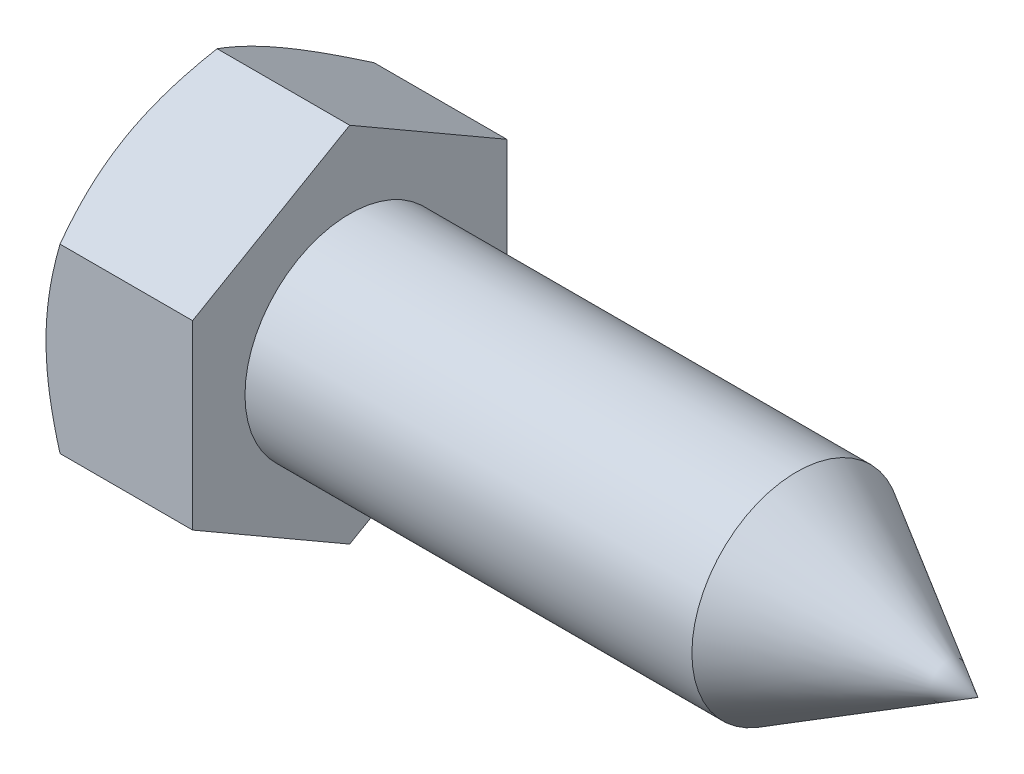
ISO-10303-21;
HEADER;
FILE_DESCRIPTION(('STEP AP214'),'2;1');
FILE_NAME('part.step','',(''),(''),'','','');
FILE_SCHEMA(('AUTOMOTIVE_DESIGN { 1 0 10303 214 1 1 1 1 }'));
ENDSEC;
DATA;
#1=APPLICATION_CONTEXT('core data for automotive mechanical design processes');
#2=APPLICATION_PROTOCOL_DEFINITION('international standard','automotive_design',2000,#1);
#3=PRODUCT_CONTEXT('',#1,'mechanical');
#4=PRODUCT('Part','Part','',(#3));
#5=PRODUCT_RELATED_PRODUCT_CATEGORY('part','',(#4));
#6=PRODUCT_DEFINITION_FORMATION('','',#4);
#7=PRODUCT_DEFINITION_CONTEXT('part definition',#1,'design');
#8=PRODUCT_DEFINITION('design','',#6,#7);
#9=PRODUCT_DEFINITION_SHAPE('','',#8);
#10=(LENGTH_UNIT() NAMED_UNIT(*) SI_UNIT(.MILLI.,.METRE.));
#11=(NAMED_UNIT(*) PLANE_ANGLE_UNIT() SI_UNIT($,.RADIAN.));
#12=(NAMED_UNIT(*) SI_UNIT($,.STERADIAN.) SOLID_ANGLE_UNIT());
#13=UNCERTAINTY_MEASURE_WITH_UNIT(LENGTH_MEASURE(1.E-05),#10,'distance_accuracy_value','');
#14=(GEOMETRIC_REPRESENTATION_CONTEXT(3) GLOBAL_UNCERTAINTY_ASSIGNED_CONTEXT((#13)) GLOBAL_UNIT_ASSIGNED_CONTEXT((#10,
#11,#12)) REPRESENTATION_CONTEXT('',''));
#15=CARTESIAN_POINT('',(0.,0.,0.));
#16=DIRECTION('',(0.,0.,1.));
#17=DIRECTION('',(1.,0.,0.));
#18=AXIS2_PLACEMENT_3D('',#15,#16,#17);
#19=CARTESIAN_POINT('',(17.78,10.9985226280624,-19.05));
#20=DIRECTION('',(0.,-0.866025403784438,0.500000000000001));
#21=DIRECTION('',(0.,-0.500000000000001,-0.866025403784438));
#22=AXIS2_PLACEMENT_3D('',#19,#20,#21);
#23=PLANE('',#22);
#24=CARTESIAN_POINT('',(1.70154403912923,21.9971607261786,0.0002));
#25=CARTESIAN_POINT('',(1.56198341710824,21.7554177843714,-0.418511057581224));
#26=CARTESIAN_POINT('',(1.42875584552933,21.5127319153775,-0.83885531295774));
#27=CARTESIAN_POINT('',(1.17672716507822,21.0254141255284,-1.68291448440842));
#28=CARTESIAN_POINT('',(1.05793080103128,20.7807815926483,-2.10663046054107));
#29=CARTESIAN_POINT('',(0.83636140347077,20.2890976796135,-2.95825197918165));
#30=CARTESIAN_POINT('',(0.733626282713295,20.0420419967675,-3.38616497416956));
#31=CARTESIAN_POINT('',(0.546385434087819,19.5462139577042,-4.24496432964444));
#32=CARTESIAN_POINT('',(0.461878662220422,19.2974417006436,-4.67585051838702));
#33=CARTESIAN_POINT('',(0.314688827717645,18.8045548928814,-5.5295555118115));
#34=CARTESIAN_POINT('',(0.251518592005309,18.5604769338332,-5.95231093789062));
#35=CARTESIAN_POINT('',(0.145596345015138,18.0712026189753,-6.79975891006299));
#36=CARTESIAN_POINT('',(0.102844726760496,17.8260062417296,-7.22445149328434));
#37=CARTESIAN_POINT('',(0.0388391678998689,17.3352016053642,-8.07455006005963));
#38=CARTESIAN_POINT('',(0.0175596817216244,17.0895941847176,-8.49995459133542));
#39=CARTESIAN_POINT('',(-0.00304398488096682,16.5981526433441,-9.3511563099444));
#40=CARTESIAN_POINT('',(-0.00236884372942559,16.3523185298569,-9.77695348473787));
#41=CARTESIAN_POINT('',(0.0194033988503021,15.8927264269825,-10.5729903576738));
#42=CARTESIAN_POINT('',(0.03784556993526,15.6789356908011,-10.9432867749275));
#43=CARTESIAN_POINT('',(0.0909844304102486,15.2518641922012,-11.6829963089671));
#44=CARTESIAN_POINT('',(0.125680887003942,15.0385834225228,-12.0524094383274));
#45=CARTESIAN_POINT('',(0.210726274890309,14.612612663106,-12.7902124361761));
#46=CARTESIAN_POINT('',(0.261089360566662,14.3999233837905,-13.1586010741756));
#47=CARTESIAN_POINT('',(0.376579300829333,13.9755573155246,-13.8936246654204));
#48=CARTESIAN_POINT('',(0.441706092858117,13.7638805222879,-14.2602596260897));
#49=CARTESIAN_POINT('',(0.660888399543239,13.121308345357,-15.3732272840641));
#50=CARTESIAN_POINT('',(0.83679916932043,12.6922737800414,-16.116336949394));
#51=CARTESIAN_POINT('',(1.23604434094317,11.840601970659,-17.5914757946184));
#52=CARTESIAN_POINT('',(1.4592849825153,11.4179538228748,-18.3235238603055));
#53=CARTESIAN_POINT('',(1.70154403912921,10.9984071580085,-19.0502));
#54=B_SPLINE_CURVE_WITH_KNOTS('',3,(#24,#25,#26,#27,#28,#29,#30,#31,#32,#33,#34,#35,#36,#37,#38,
#39,#40,#41,#42,#43,#44,#45,#46,#47,#48,#49,#50,#51,#52,#53),.UNSPECIFIED.,.F.,.F.,(4,2,2,2,2,2,
2,2,2,2,2,2,2,2,4),(0.,1.50971559281794,3.01992622800796,4.53364959201314,6.04728623691164,
7.52356313869613,8.99986845512143,10.4744153207586,11.9489166211861,13.2325441548787,
14.5161533048254,15.8009255464228,17.085692344219,19.7118183650731,22.3327898553892),.UNSPECIFIED.);
#55=CARTESIAN_POINT('',(1.70147737193763,21.9970452561248,0.));
#56=VERTEX_POINT('',#55);
#57=CARTESIAN_POINT('',(0.,16.4977839420935,-9.52500000000003));
#58=VERTEX_POINT('',#57);
#59=EDGE_CURVE('E48',#56,#58,#54,.T.);
#60=ORIENTED_EDGE('',*,*,#59,.F.);
#61=DIRECTION('',(-1.,0.,0.));
#62=VECTOR('',#61,1.);
#63=CARTESIAN_POINT('',(17.78,21.9970452561248,0.));
#64=LINE('',#63,#62);
#65=CARTESIAN_POINT('',(17.78,21.9970452561248,0.));
#66=VERTEX_POINT('',#65);
#67=EDGE_CURVE('E147',#66,#56,#64,.T.);
#68=ORIENTED_EDGE('',*,*,#67,.F.);
#69=DIRECTION('',(0.,0.500000000000001,0.866025403784438));
#70=VECTOR('',#69,1.);
#71=CARTESIAN_POINT('',(17.78,10.9985226280624,-19.05));
#72=LINE('',#71,#70);
#73=CARTESIAN_POINT('',(17.78,10.9985226280624,-19.05));
#74=VERTEX_POINT('',#73);
#75=EDGE_CURVE('E232',#74,#66,#72,.T.);
#76=ORIENTED_EDGE('',*,*,#75,.F.);
#77=DIRECTION('',(-1.,0.,0.));
#78=VECTOR('',#77,1.);
#79=CARTESIAN_POINT('',(17.78,10.9985226280624,-19.05));
#80=LINE('',#79,#78);
#81=CARTESIAN_POINT('',(1.70147737193761,10.9985226280624,-19.05));
#82=VERTEX_POINT('',#81);
#83=EDGE_CURVE('E135',#74,#82,#80,.T.);
#84=ORIENTED_EDGE('',*,*,#83,.T.);
#85=EDGE_CURVE('E129',#58,#82,#54,.T.);
#86=ORIENTED_EDGE('',*,*,#85,.F.);
#87=EDGE_LOOP('',(#60,#68,#76,#84,#86));
#88=FACE_BOUND('',#87,.T.);
#89=ADVANCED_FACE('F32',(#88),#23,.F.);
#90=CARTESIAN_POINT('',(17.78,21.9970452561248,0.));
#91=DIRECTION('',(0.,-0.866025403784438,-0.500000000000001));
#92=DIRECTION('',(0.,0.500000000000001,-0.866025403784438));
#93=AXIS2_PLACEMENT_3D('',#90,#91,#92);
#94=PLANE('',#93);
#95=CARTESIAN_POINT('',(1.70154403912922,10.9984071580085,19.0502));
#96=CARTESIAN_POINT('',(1.56198341710822,11.2401500998157,18.6314889424188));
#97=CARTESIAN_POINT('',(1.42875584552932,11.4828359688097,18.2111446870423));
#98=CARTESIAN_POINT('',(1.17672716507821,11.9701537586587,17.3670855155916));
#99=CARTESIAN_POINT('',(1.05793080103127,12.2147862915388,16.9433695394589));
#100=CARTESIAN_POINT('',(0.836361403470762,12.7064702045736,16.0917480208183));
#101=CARTESIAN_POINT('',(0.733626282713287,12.9535258874196,15.6638350258304));
#102=CARTESIAN_POINT('',(0.546385434087812,13.4493539264829,14.8050356703556));
#103=CARTESIAN_POINT('',(0.461878662220417,13.6981261835436,14.374149481613));
#104=CARTESIAN_POINT('',(0.314688827717642,14.1910129913057,13.5204444881885));
#105=CARTESIAN_POINT('',(0.251518592005306,14.4350909503539,13.0976890621094));
#106=CARTESIAN_POINT('',(0.145596345015136,14.9243652652118,12.250241089937));
#107=CARTESIAN_POINT('',(0.102844726760495,15.1695616424575,11.8255485067157));
#108=CARTESIAN_POINT('',(0.0388391678998689,15.6603662788229,10.9754499399404));
#109=CARTESIAN_POINT('',(0.0175596817216246,15.9059736994695,10.5500454086646));
#110=CARTESIAN_POINT('',(-0.00304398488096499,16.397415240843,9.69884369005561));
#111=CARTESIAN_POINT('',(-0.00236884372942224,16.6432493543302,9.27304651526214));
#112=CARTESIAN_POINT('',(0.0194033988503066,17.1028414572046,8.47700964232625));
#113=CARTESIAN_POINT('',(0.0378455699352645,17.316632193386,8.10671322507253));
#114=CARTESIAN_POINT('',(0.0909844304102546,17.7437036919859,7.36700369103291));
#115=CARTESIAN_POINT('',(0.125680887003949,17.9569844616643,6.99759056167259));
#116=CARTESIAN_POINT('',(0.210726274890318,18.3829552210812,6.25978756382388));
#117=CARTESIAN_POINT('',(0.26108936056667,18.5956445003966,5.89139892582437));
#118=CARTESIAN_POINT('',(0.376579300829342,19.0200105686625,5.15637533457961));
#119=CARTESIAN_POINT('',(0.441706092858128,19.2316873618992,4.7897403739103));
#120=CARTESIAN_POINT('',(0.660888399543252,19.8742595388301,3.67677271593589));
#121=CARTESIAN_POINT('',(0.836799169320443,20.3032941041457,2.93366305060603));
#122=CARTESIAN_POINT('',(1.23604434094318,21.1549659135281,1.45852420538159));
#123=CARTESIAN_POINT('',(1.45928498251531,21.5776140613123,0.726476139694543));
#124=CARTESIAN_POINT('',(1.70154403912923,21.9971607261786,-0.000199999999998885));
#125=B_SPLINE_CURVE_WITH_KNOTS('',3,(#95,#96,#97,#98,#99,#100,#101,#102,#103,#104,#105,#106,
#107,#108,#109,#110,#111,#112,#113,#114,#115,#116,#117,#118,#119,#120,#121,#122,#123,#124),
.UNSPECIFIED.,.F.,.F.,(4,2,2,2,2,2,2,2,2,2,2,2,2,2,4),(0.,1.50971559281794,3.01992622800796,
4.53364959201314,6.04728623691163,7.52356313869613,8.99986845512142,10.4744153207586,
11.9489166211861,13.2325441548787,14.5161533048254,15.8009255464228,17.085692344219,
19.7118183650731,22.3327898553892),.UNSPECIFIED.);
#126=CARTESIAN_POINT('',(1.70147737193762,10.9985226280624,19.05));
#127=VERTEX_POINT('',#126);
#128=CARTESIAN_POINT('',(0.,16.4977839420935,9.52500000000002));
#129=VERTEX_POINT('',#128);
#130=EDGE_CURVE('E55',#127,#129,#125,.T.);
#131=ORIENTED_EDGE('',*,*,#130,.F.);
#132=DIRECTION('',(-1.,0.,0.));
#133=VECTOR('',#132,1.);
#134=CARTESIAN_POINT('',(17.78,10.9985226280624,19.05));
#135=LINE('',#134,#133);
#136=CARTESIAN_POINT('',(17.78,10.9985226280624,19.05));
#137=VERTEX_POINT('',#136);
#138=EDGE_CURVE('E145',#137,#127,#135,.T.);
#139=ORIENTED_EDGE('',*,*,#138,.F.);
#140=DIRECTION('',(0.,-0.500000000000001,0.866025403784438));
#141=VECTOR('',#140,1.);
#142=CARTESIAN_POINT('',(17.78,21.9970452561248,0.));
#143=LINE('',#142,#141);
#144=EDGE_CURVE('E230',#66,#137,#143,.T.);
#145=ORIENTED_EDGE('',*,*,#144,.F.);
#146=ORIENTED_EDGE('',*,*,#67,.T.);
#147=EDGE_CURVE('E162',#129,#56,#125,.T.);
#148=ORIENTED_EDGE('',*,*,#147,.F.);
#149=EDGE_LOOP('',(#131,#139,#145,#146,#148));
#150=FACE_BOUND('',#149,.T.);
#151=ADVANCED_FACE('F168',(#150),#94,.F.);
#152=CARTESIAN_POINT('',(17.78,10.9985226280624,19.05));
#153=DIRECTION('',(0.,0.,-1.));
#154=DIRECTION('',(-1.,0.,0.));
#155=AXIS2_PLACEMENT_3D('',#152,#153,#154);
#156=PLANE('',#155);
#157=CARTESIAN_POINT('',(9.36387045247343,-29.681284606613,19.05));
#158=CARTESIAN_POINT('',(9.16146582961974,-29.264706606806,19.05));
#159=CARTESIAN_POINT('',(8.96006010911688,-28.8476434945091,19.05));
#160=CARTESIAN_POINT('',(8.55947242837995,-28.0124458613825,19.05));
#161=CARTESIAN_POINT('',(8.36029049009429,-27.5943113300281,19.05));
#162=CARTESIAN_POINT('',(7.7663676810725,-26.3380393948462,19.05));
#163=CARTESIAN_POINT('',(7.37530881268534,-25.498154743662,19.05));
#164=CARTESIAN_POINT('',(6.60327220097087,-23.808305939745,19.05));
#165=CARTESIAN_POINT('',(6.22235974347411,-22.9583118892264,19.05));
#166=CARTESIAN_POINT('',(5.47593301915302,-21.2516124787001,19.05));
#167=CARTESIAN_POINT('',(5.11041803414068,-20.3949074339305,19.05));
#168=CARTESIAN_POINT('',(4.38719116879672,-18.6452025304738,19.05));
#169=CARTESIAN_POINT('',(4.03012757182363,-17.7519333199389,19.05));
#170=CARTESIAN_POINT('',(3.34269044233918,-15.9549889007312,19.05));
#171=CARTESIAN_POINT('',(3.01231988615571,-15.0513125444405,19.05));
#172=CARTESIAN_POINT('',(2.38684616332965,-13.2337927829517,19.05));
#173=CARTESIAN_POINT('',(2.09167277054079,-12.3199737386897,19.05));
#174=CARTESIAN_POINT('',(1.54595671315604,-10.4791413209231,19.05));
#175=CARTESIAN_POINT('',(1.29540013570895,-9.55213215820611,19.05));
#176=CARTESIAN_POINT('',(0.962715893913424,-8.15413474991851,19.05));
#177=CARTESIAN_POINT('',(0.859241701469715,-7.68819648348643,19.05));
#178=CARTESIAN_POINT('',(0.667894608167373,-6.75311076402833,19.05));
#179=CARTESIAN_POINT('',(0.580021393447899,-6.28396337576073,19.05));
#180=CARTESIAN_POINT('',(0.421420281134063,-5.34278179688777,19.05));
#181=CARTESIAN_POINT('',(0.350691777614133,-4.87074770890834,19.05));
#182=CARTESIAN_POINT('',(0.227781142117217,-3.92425443579507,19.05));
#183=CARTESIAN_POINT('',(0.175598996477116,-3.44979525244806,19.05));
#184=CARTESIAN_POINT('',(0.091484358665081,-2.50539642167933,19.05));
#185=CARTESIAN_POINT('',(0.0592932834122934,-2.03547994750786,19.05));
#186=CARTESIAN_POINT('',(0.0148196511049127,-1.09470720819043,19.05));
#187=CARTESIAN_POINT('',(0.00253675993371639,-0.623850958949376,19.05));
#188=CARTESIAN_POINT('',(-0.00182781610310269,0.317959597669875,19.05));
#189=CARTESIAN_POINT('',(0.00609054987868912,0.788913905291908,19.05));
#190=CARTESIAN_POINT('',(0.0419336308306925,1.73006593492375,19.05));
#191=CARTESIAN_POINT('',(0.0698592408268269,2.20026362214292,19.05));
#192=CARTESIAN_POINT('',(0.160085140812835,3.32615149168687,19.05));
#193=CARTESIAN_POINT('',(0.231647760253748,3.9811127561872,19.05));
#194=CARTESIAN_POINT('',(0.409728300065855,5.2862687094639,19.05));
#195=CARTESIAN_POINT('',(0.516250858977386,5.93646275400804,19.05));
#196=CARTESIAN_POINT('',(0.760462128297077,7.23143263105088,19.05));
#197=CARTESIAN_POINT('',(0.898174747996119,7.87620391130365,19.05));
#198=CARTESIAN_POINT('',(1.20055584405695,9.159324879215,19.05));
#199=CARTESIAN_POINT('',(1.36522394390489,9.79767465643689,19.05));
#200=CARTESIAN_POINT('',(1.7214113056863,11.0820581020298,19.05));
#201=CARTESIAN_POINT('',(1.91344522350516,11.7279480495079,19.05));
#202=CARTESIAN_POINT('',(2.31762854711575,13.0133672560354,19.05));
#203=CARTESIAN_POINT('',(2.52977808690826,13.6528964726813,19.05));
#204=CARTESIAN_POINT('',(2.97080026317714,14.9259053212631,19.05));
#205=CARTESIAN_POINT('',(3.19966751894679,15.5593868261181,19.05));
#206=CARTESIAN_POINT('',(3.67140574966712,16.8210826190597,19.05));
#207=CARTESIAN_POINT('',(3.91427655235636,17.4492969718302,19.05));
#208=CARTESIAN_POINT('',(4.50783243685458,18.9429543286684,19.05));
#209=CARTESIAN_POINT('',(4.86391009787127,19.8062512923856,19.05));
#210=CARTESIAN_POINT('',(5.59369975040599,21.5253820385326,19.05));
#211=CARTESIAN_POINT('',(5.96741288850359,22.3812153314103,19.05));
#212=CARTESIAN_POINT('',(6.72890710622893,24.0868250540015,19.05));
#213=CARTESIAN_POINT('',(7.11669148004349,24.9366000089695,19.05));
#214=CARTESIAN_POINT('',(7.90345923334426,26.63091294583,19.05));
#215=CARTESIAN_POINT('',(8.3024423596857,27.4754510455742,19.05));
#216=CARTESIAN_POINT('',(9.10995217038491,29.161125765359,19.05));
#217=CARTESIAN_POINT('',(9.5184891939498,30.0022574236751,19.05));
#218=CARTESIAN_POINT('',(10.3430229269526,31.6808559628692,19.05));
#219=CARTESIAN_POINT('',(10.7590196703666,32.518322827034,19.05));
#220=CARTESIAN_POINT('',(11.5971269180795,34.1900490644371,19.05));
#221=CARTESIAN_POINT('',(12.0192366018988,35.0243088494536,19.05));
#222=CARTESIAN_POINT('',(12.8686125952728,36.6901944514231,19.05));
#223=CARTESIAN_POINT('',(13.2958788947363,37.5218202735267,19.05));
#224=CARTESIAN_POINT('',(14.510917657863,39.8716762337095,19.05));
#225=CARTESIAN_POINT('',(15.3037675196573,41.3872809173331,19.05));
#226=CARTESIAN_POINT('',(16.9002701357266,44.4128482567193,19.05));
#227=CARTESIAN_POINT('',(17.7039232916796,45.9228107000148,19.05));
#228=CARTESIAN_POINT('',(19.3174048995091,48.9344252680923,19.05));
#229=CARTESIAN_POINT('',(20.1272121106646,50.4360887804975,19.05));
#230=CARTESIAN_POINT('',(21.3467150335648,52.6859282817833,19.05));
#231=CARTESIAN_POINT('',(21.7540032158491,53.4354111964365,19.05));
#232=CARTESIAN_POINT('',(22.5700166567681,54.9335928565355,19.05));
#233=CARTESIAN_POINT('',(22.9787419131725,55.6822916031958,19.05));
#234=CARTESIAN_POINT('',(23.3881024870587,56.4306429205237,19.05));
#235=B_SPLINE_CURVE_WITH_KNOTS('',3,(#157,#158,#159,#160,#161,#162,#163,#164,#165,#166,#167,
#168,#169,#170,#171,#172,#173,#174,#175,#176,#177,#178,#179,#180,#181,#182,#183,#184,#185,#186,
#187,#188,#189,#190,#191,#192,#193,#194,#195,#196,#197,#198,#199,#200,#201,#202,#203,#204,#205,
#206,#207,#208,#209,#210,#211,#212,#213,#214,#215,#216,#217,#218,#219,#220,#221,#222,#223,#224,
#225,#226,#227,#228,#229,#230,#231,#232,#233,#234),.UNSPECIFIED.,.F.,.F.,(4,2,2,2,2,2,2,2,2,2,2,
2,2,2,2,2,2,2,2,2,2,2,2,2,2,2,2,2,2,2,2,2,2,2,2,2,2,2,4),(0.,1.38943761217531,2.77888892580274,
5.55819563283588,8.35240254614278,11.1464789839499,14.0321224955357,16.9180873194337,
19.7981940796754,22.6774011581476,24.1090510836395,25.5406722038995,26.9722427206616,
28.4038121827825,29.8164561105849,31.2290763299128,32.6417001048686,34.0543870776267,
36.0298747033623,38.0056245459738,39.9828940915955,41.9601360210948,43.9812438973033,
46.0023652381249,48.0228389099964,50.0432877327721,52.8445655115302,55.6460256683976,
58.4481459548751,61.2502029511148,64.0554471757798,66.8607041804397,69.665588089998,
72.4704665113671,77.6017760453958,82.7332768976462,87.8515588562165,90.4105564703669,
92.9695501149091),.UNSPECIFIED.);
#236=CARTESIAN_POINT('',(1.70147737193761,-10.9985226280623,19.05));
#237=VERTEX_POINT('',#236);
#238=CARTESIAN_POINT('',(0.,0.,19.05));
#239=VERTEX_POINT('',#238);
#240=EDGE_CURVE('E239',#237,#239,#235,.T.);
#241=ORIENTED_EDGE('',*,*,#240,.F.);
#242=DIRECTION('',(-1.,0.,0.));
#243=VECTOR('',#242,1.);
#244=CARTESIAN_POINT('',(17.78,-10.9985226280623,19.05));
#245=LINE('',#244,#243);
#246=CARTESIAN_POINT('',(17.78,-10.9985226280623,19.05));
#247=VERTEX_POINT('',#246);
#248=EDGE_CURVE('E137',#247,#237,#245,.T.);
#249=ORIENTED_EDGE('',*,*,#248,.F.);
#250=DIRECTION('',(0.,-1.,0.));
#251=VECTOR('',#250,1.);
#252=CARTESIAN_POINT('',(17.78,10.9985226280624,19.05));
#253=LINE('',#252,#251);
#254=EDGE_CURVE('E226',#137,#247,#253,.T.);
#255=ORIENTED_EDGE('',*,*,#254,.F.);
#256=ORIENTED_EDGE('',*,*,#138,.T.);
#257=EDGE_CURVE('E184',#239,#127,#235,.T.);
#258=ORIENTED_EDGE('',*,*,#257,.F.);
#259=EDGE_LOOP('',(#241,#249,#255,#256,#258));
#260=FACE_BOUND('',#259,.T.);
#261=ADVANCED_FACE('F245',(#260),#156,.F.);
#262=CARTESIAN_POINT('',(17.78,-21.9970452561248,0.));
#263=DIRECTION('',(0.,0.866025403784438,-0.500000000000002));
#264=DIRECTION('',(0.,0.500000000000002,0.866025403784438));
#265=AXIS2_PLACEMENT_3D('',#262,#263,#264);
#266=PLANE('',#265);
#267=CARTESIAN_POINT('',(1.70154403912923,-21.9971607261786,-0.000200000000000067));
#268=CARTESIAN_POINT('',(1.56198341710824,-21.7554177843714,0.418511057581222));
#269=CARTESIAN_POINT('',(1.42875584552933,-21.5127319153775,0.838855312957738));
#270=CARTESIAN_POINT('',(1.17672716507822,-21.0254141255284,1.68291448440842));
#271=CARTESIAN_POINT('',(1.05793080103128,-20.7807815926483,2.10663046054107));
#272=CARTESIAN_POINT('',(0.836361403470769,-20.2890976796135,2.95825197918165));
#273=CARTESIAN_POINT('',(0.733626282713293,-20.0420419967675,3.38616497416956));
#274=CARTESIAN_POINT('',(0.546385434087817,-19.5462139577042,4.24496432964444));
#275=CARTESIAN_POINT('',(0.461878662220421,-19.2974417006435,4.67585051838702));
#276=CARTESIAN_POINT('',(0.314688827717642,-18.8045548928814,5.5295555118115));
#277=CARTESIAN_POINT('',(0.251518592005304,-18.5604769338332,5.95231093789062));
#278=CARTESIAN_POINT('',(0.145596345015132,-18.0712026189753,6.79975891006298));
#279=CARTESIAN_POINT('',(0.102844726760491,-17.8260062417296,7.22445149328434));
#280=CARTESIAN_POINT('',(0.0388391678998642,-17.3352016053642,8.07455006005963));
#281=CARTESIAN_POINT('',(0.0175596817216182,-17.0895941847176,8.49995459133541));
#282=CARTESIAN_POINT('',(-0.00304398488097359,-16.5981526433441,9.35115630994439));
#283=CARTESIAN_POINT('',(-0.00236884372943127,-16.3523185298569,9.77695348473786));
#284=CARTESIAN_POINT('',(0.0194033988502967,-15.8927264269825,10.5729903576737));
#285=CARTESIAN_POINT('',(0.0378455699352542,-15.6789356908011,10.9432867749275));
#286=CARTESIAN_POINT('',(0.0909844304102423,-15.2518641922012,11.6829963089671));
#287=CARTESIAN_POINT('',(0.125680887003936,-15.0385834225228,12.0524094383274));
#288=CARTESIAN_POINT('',(0.210726274890302,-14.6126126631059,12.7902124361761));
#289=CARTESIAN_POINT('',(0.261089360566655,-14.3999233837905,13.1586010741756));
#290=CARTESIAN_POINT('',(0.376579300829327,-13.9755573155246,13.8936246654204));
#291=CARTESIAN_POINT('',(0.441706092858111,-13.7638805222879,14.2602596260897));
#292=CARTESIAN_POINT('',(0.660888399543233,-13.121308345357,15.3732272840641));
#293=CARTESIAN_POINT('',(0.836799169320424,-12.6922737800414,16.116336949394));
#294=CARTESIAN_POINT('',(1.23604434094316,-11.840601970659,17.5914757946184));
#295=CARTESIAN_POINT('',(1.45928498251529,-11.4179538228748,18.3235238603055));
#296=CARTESIAN_POINT('',(1.70154403912921,-10.9984071580085,19.0502));
#297=B_SPLINE_CURVE_WITH_KNOTS('',3,(#267,#268,#269,#270,#271,#272,#273,#274,#275,#276,#277,
#278,#279,#280,#281,#282,#283,#284,#285,#286,#287,#288,#289,#290,#291,#292,#293,#294,#295,#296),
.UNSPECIFIED.,.F.,.F.,(4,2,2,2,2,2,2,2,2,2,2,2,2,2,4),(0.,1.50971559281794,3.01992622800796,
4.53364959201314,6.04728623691164,7.52356313869613,8.99986845512143,10.4744153207586,
11.9489166211861,13.2325441548787,14.5161533048254,15.8009255464228,17.085692344219,
19.7118183650732,22.3327898553893),.UNSPECIFIED.);
#298=CARTESIAN_POINT('',(1.70147737193763,-21.9970452561248,0.));
#299=VERTEX_POINT('',#298);
#300=CARTESIAN_POINT('',(0.,-16.4977839420935,9.52500000000004));
#301=VERTEX_POINT('',#300);
#302=EDGE_CURVE('E170',#299,#301,#297,.T.);
#303=ORIENTED_EDGE('',*,*,#302,.F.);
#304=DIRECTION('',(-1.,0.,0.));
#305=VECTOR('',#304,1.);
#306=CARTESIAN_POINT('',(17.78,-21.9970452561248,0.));
#307=LINE('',#306,#305);
#308=CARTESIAN_POINT('',(17.78,-21.9970452561248,0.));
#309=VERTEX_POINT('',#308);
#310=EDGE_CURVE('E134',#309,#299,#307,.T.);
#311=ORIENTED_EDGE('',*,*,#310,.F.);
#312=DIRECTION('',(0.,-0.500000000000002,-0.866025403784438));
#313=VECTOR('',#312,1.);
#314=CARTESIAN_POINT('',(17.78,-21.9970452561248,0.));
#315=LINE('',#314,#313);
#316=EDGE_CURVE('E224',#247,#309,#315,.T.);
#317=ORIENTED_EDGE('',*,*,#316,.F.);
#318=ORIENTED_EDGE('',*,*,#248,.T.);
#319=EDGE_CURVE('E172',#301,#237,#297,.T.);
#320=ORIENTED_EDGE('',*,*,#319,.F.);
#321=EDGE_LOOP('',(#303,#311,#317,#318,#320));
#322=FACE_BOUND('',#321,.T.);
#323=ADVANCED_FACE('F220',(#322),#266,.F.);
#324=CARTESIAN_POINT('',(17.78,-10.9985226280624,-19.05));
#325=DIRECTION('',(0.,0.866025403784439,0.5));
#326=DIRECTION('',(0.,-0.5,0.866025403784439));
#327=AXIS2_PLACEMENT_3D('',#324,#325,#326);
#328=PLANE('',#327);
#329=CARTESIAN_POINT('',(1.70154403912922,-10.9984071580086,-19.0502));
#330=CARTESIAN_POINT('',(1.56198341710823,-11.2401500998157,-18.6314889424188));
#331=CARTESIAN_POINT('',(1.42875584552933,-11.4828359688097,-18.2111446870423));
#332=CARTESIAN_POINT('',(1.17672716507822,-11.9701537586587,-17.3670855155916));
#333=CARTESIAN_POINT('',(1.05793080103128,-12.2147862915388,-16.9433695394589));
#334=CARTESIAN_POINT('',(0.836361403470769,-12.7064702045737,-16.0917480208183));
#335=CARTESIAN_POINT('',(0.733626282713294,-12.9535258874197,-15.6638350258304));
#336=CARTESIAN_POINT('',(0.546385434087819,-13.449353926483,-14.8050356703556));
#337=CARTESIAN_POINT('',(0.461878662220424,-13.6981261835436,-14.374149481613));
#338=CARTESIAN_POINT('',(0.314688827717648,-14.1910129913057,-13.5204444881885));
#339=CARTESIAN_POINT('',(0.251518592005311,-14.4350909503539,-13.0976890621094));
#340=CARTESIAN_POINT('',(0.145596345015141,-14.9243652652118,-12.250241089937));
#341=CARTESIAN_POINT('',(0.102844726760501,-15.1695616424575,-11.8255485067157));
#342=CARTESIAN_POINT('',(0.0388391678998761,-15.6603662788229,-10.9754499399404));
#343=CARTESIAN_POINT('',(0.0175596817216313,-15.9059736994695,-10.5500454086646));
#344=CARTESIAN_POINT('',(-0.00304398488095869,-16.3974152408431,-9.6988436900556));
#345=CARTESIAN_POINT('',(-0.00236884372941574,-16.6432493543302,-9.27304651526213));
#346=CARTESIAN_POINT('',(0.0194033988503131,-17.1028414572047,-8.47700964232624));
#347=CARTESIAN_POINT('',(0.0378455699352709,-17.316632193386,-8.10671322507252));
#348=CARTESIAN_POINT('',(0.0909844304102597,-17.7437036919859,-7.3670036910329));
#349=CARTESIAN_POINT('',(0.125680887003953,-17.9569844616643,-6.99759056167259));
#350=CARTESIAN_POINT('',(0.210726274890321,-18.3829552210812,-6.25978756382388));
#351=CARTESIAN_POINT('',(0.261089360566673,-18.5956445003966,-5.89139892582437));
#352=CARTESIAN_POINT('',(0.376579300829346,-19.0200105686625,-5.15637533457961));
#353=CARTESIAN_POINT('',(0.441706092858132,-19.2316873618992,-4.78974037391031));
#354=CARTESIAN_POINT('',(0.660888399543257,-19.8742595388301,-3.67677271593589));
#355=CARTESIAN_POINT('',(0.836799169320446,-20.3032941041457,-2.93366305060604));
#356=CARTESIAN_POINT('',(1.23604434094318,-21.1549659135281,-1.45852420538159));
#357=CARTESIAN_POINT('',(1.45928498251531,-21.5776140613123,-0.726476139694542));
#358=CARTESIAN_POINT('',(1.70154403912923,-21.9971607261786,0.000199999999998958));
#359=B_SPLINE_CURVE_WITH_KNOTS('',3,(#329,#330,#331,#332,#333,#334,#335,#336,#337,#338,#339,
#340,#341,#342,#343,#344,#345,#346,#347,#348,#349,#350,#351,#352,#353,#354,#355,#356,#357,#358),
.UNSPECIFIED.,.F.,.F.,(4,2,2,2,2,2,2,2,2,2,2,2,2,2,4),(0.,1.50971559281794,3.01992622800796,
4.53364959201314,6.04728623691163,7.52356313869612,8.99986845512142,10.4744153207586,
11.9489166211861,13.2325441548787,14.5161533048254,15.8009255464228,17.085692344219,
19.7118183650731,22.3327898553892),.UNSPECIFIED.);
#360=CARTESIAN_POINT('',(1.70147737193763,-10.9985226280624,-19.05));
#361=VERTEX_POINT('',#360);
#362=CARTESIAN_POINT('',(0.,-16.4977839420936,-9.525));
#363=VERTEX_POINT('',#362);
#364=EDGE_CURVE('E111',#361,#363,#359,.T.);
#365=ORIENTED_EDGE('',*,*,#364,.F.);
#366=DIRECTION('',(-1.,0.,0.));
#367=VECTOR('',#366,1.);
#368=CARTESIAN_POINT('',(17.78,-10.9985226280624,-19.05));
#369=LINE('',#368,#367);
#370=CARTESIAN_POINT('',(17.78,-10.9985226280624,-19.05));
#371=VERTEX_POINT('',#370);
#372=EDGE_CURVE('E125',#371,#361,#369,.T.);
#373=ORIENTED_EDGE('',*,*,#372,.F.);
#374=DIRECTION('',(0.,0.5,-0.866025403784439));
#375=VECTOR('',#374,1.);
#376=CARTESIAN_POINT('',(17.78,-10.9985226280624,-19.05));
#377=LINE('',#376,#375);
#378=EDGE_CURVE('E222',#309,#371,#377,.T.);
#379=ORIENTED_EDGE('',*,*,#378,.F.);
#380=ORIENTED_EDGE('',*,*,#310,.T.);
#381=EDGE_CURVE('E128',#363,#299,#359,.T.);
#382=ORIENTED_EDGE('',*,*,#381,.F.);
#383=EDGE_LOOP('',(#365,#373,#379,#380,#382));
#384=FACE_BOUND('',#383,.T.);
#385=ADVANCED_FACE('F123',(#384),#328,.F.);
#386=CARTESIAN_POINT('',(17.78,10.9985226280624,-19.05));
#387=DIRECTION('',(0.,0.,1.));
#388=DIRECTION('',(1.,0.,0.));
#389=AXIS2_PLACEMENT_3D('',#386,#387,#388);
#390=PLANE('',#389);
#391=CARTESIAN_POINT('',(9.36387045247347,-29.6812846066131,-19.05));
#392=CARTESIAN_POINT('',(9.16146582961978,-29.264706606806,-19.05));
#393=CARTESIAN_POINT('',(8.96006010911692,-28.8476434945092,-19.05));
#394=CARTESIAN_POINT('',(8.55947242837999,-28.0124458613826,-19.05));
#395=CARTESIAN_POINT('',(8.36029049009433,-27.5943113300282,-19.05));
#396=CARTESIAN_POINT('',(7.76636768107253,-26.3380393948462,-19.05));
#397=CARTESIAN_POINT('',(7.37530881268537,-25.498154743662,-19.05));
#398=CARTESIAN_POINT('',(6.6032722009709,-23.8083059397451,-19.05));
#399=CARTESIAN_POINT('',(6.22235974347414,-22.9583118892265,-19.05));
#400=CARTESIAN_POINT('',(5.47593301915305,-21.2516124787002,-19.05));
#401=CARTESIAN_POINT('',(5.11041803414071,-20.3949074339305,-19.05));
#402=CARTESIAN_POINT('',(4.38719116879675,-18.6452025304738,-19.05));
#403=CARTESIAN_POINT('',(4.03012757182365,-17.751933319939,-19.05));
#404=CARTESIAN_POINT('',(3.3426904423392,-15.9549889007313,-19.05));
#405=CARTESIAN_POINT('',(3.01231988615573,-15.0513125444405,-19.05));
#406=CARTESIAN_POINT('',(2.38684616332967,-13.2337927829517,-19.05));
#407=CARTESIAN_POINT('',(2.09167277054081,-12.3199737386898,-19.05));
#408=CARTESIAN_POINT('',(1.54595671315605,-10.4791413209232,-19.05));
#409=CARTESIAN_POINT('',(1.29540013570897,-9.55213215820616,-19.05));
#410=CARTESIAN_POINT('',(0.962715893913435,-8.15413474991856,-19.05));
#411=CARTESIAN_POINT('',(0.859241701469724,-7.68819648348648,-19.05));
#412=CARTESIAN_POINT('',(0.66789460816738,-6.75311076402837,-19.05));
#413=CARTESIAN_POINT('',(0.580021393447906,-6.28396337576078,-19.05));
#414=CARTESIAN_POINT('',(0.421420281134069,-5.34278179688782,-19.05));
#415=CARTESIAN_POINT('',(0.350691777614139,-4.87074770890838,-19.05));
#416=CARTESIAN_POINT('',(0.227781142117223,-3.92425443579511,-19.05));
#417=CARTESIAN_POINT('',(0.175598996477123,-3.44979525244811,-19.05));
#418=CARTESIAN_POINT('',(0.0914843586650862,-2.50539642167937,-19.05));
#419=CARTESIAN_POINT('',(0.0592932834122965,-2.03547994750791,-19.05));
#420=CARTESIAN_POINT('',(0.0148196511049136,-1.09470720819047,-19.05));
#421=CARTESIAN_POINT('',(0.00253675993371739,-0.623850958949421,-19.05));
#422=CARTESIAN_POINT('',(-0.00182781610310368,0.317959597669829,-19.05));
#423=CARTESIAN_POINT('',(0.00609054987868606,0.788913905291862,-19.05));
#424=CARTESIAN_POINT('',(0.0419336308306876,1.73006593492371,-19.05));
#425=CARTESIAN_POINT('',(0.0698592408268225,2.20026362214288,-19.05));
#426=CARTESIAN_POINT('',(0.160085140812831,3.32615149168683,-19.05));
#427=CARTESIAN_POINT('',(0.231647760253744,3.98111275618715,-19.05));
#428=CARTESIAN_POINT('',(0.409728300065848,5.28626870946384,-19.05));
#429=CARTESIAN_POINT('',(0.516250858977375,5.93646275400798,-19.05));
#430=CARTESIAN_POINT('',(0.760462128297064,7.23143263105083,-19.05));
#431=CARTESIAN_POINT('',(0.898174747996107,7.87620391130359,-19.05));
#432=CARTESIAN_POINT('',(1.20055584405693,9.15932487921494,-19.05));
#433=CARTESIAN_POINT('',(1.36522394390487,9.79767465643683,-19.05));
#434=CARTESIAN_POINT('',(1.72141130568628,11.0820581020297,-19.05));
#435=CARTESIAN_POINT('',(1.91344522350514,11.7279480495078,-19.05));
#436=CARTESIAN_POINT('',(2.31762854711573,13.0133672560353,-19.05));
#437=CARTESIAN_POINT('',(2.52977808690824,13.6528964726812,-19.05));
#438=CARTESIAN_POINT('',(2.97080026317712,14.9259053212631,-19.05));
#439=CARTESIAN_POINT('',(3.19966751894677,15.5593868261181,-19.05));
#440=CARTESIAN_POINT('',(3.67140574966709,16.8210826190597,-19.05));
#441=CARTESIAN_POINT('',(3.91427655235634,17.4492969718301,-19.05));
#442=CARTESIAN_POINT('',(4.50783243685455,18.9429543286683,-19.05));
#443=CARTESIAN_POINT('',(4.86391009787124,19.8062512923856,-19.05));
#444=CARTESIAN_POINT('',(5.59369975040596,21.5253820385326,-19.05));
#445=CARTESIAN_POINT('',(5.96741288850356,22.3812153314102,-19.05));
#446=CARTESIAN_POINT('',(6.7289071062289,24.0868250540014,-19.05));
#447=CARTESIAN_POINT('',(7.11669148004346,24.9366000089695,-19.05));
#448=CARTESIAN_POINT('',(7.90345923334423,26.63091294583,-19.05));
#449=CARTESIAN_POINT('',(8.30244235968568,27.4754510455741,-19.05));
#450=CARTESIAN_POINT('',(9.10995217038488,29.161125765359,-19.05));
#451=CARTESIAN_POINT('',(9.51848919394977,30.0022574236751,-19.05));
#452=CARTESIAN_POINT('',(10.3430229269526,31.6808559628692,-19.05));
#453=CARTESIAN_POINT('',(10.7590196703666,32.5183228270339,-19.05));
#454=CARTESIAN_POINT('',(11.5971269180795,34.1900490644371,-19.05));
#455=CARTESIAN_POINT('',(12.0192366018987,35.0243088494535,-19.05));
#456=CARTESIAN_POINT('',(12.8686125952728,36.690194451423,-19.05));
#457=CARTESIAN_POINT('',(13.2958788947363,37.5218202735267,-19.05));
#458=CARTESIAN_POINT('',(14.510917657863,39.8716762337095,-19.05));
#459=CARTESIAN_POINT('',(15.3037675196573,41.3872809173331,-19.05));
#460=CARTESIAN_POINT('',(16.9002701357265,44.4128482567192,-19.05));
#461=CARTESIAN_POINT('',(17.7039232916796,45.9228107000148,-19.05));
#462=CARTESIAN_POINT('',(19.3174048995091,48.9344252680923,-19.05));
#463=CARTESIAN_POINT('',(20.1272121106646,50.4360887804975,-19.05));
#464=CARTESIAN_POINT('',(21.3467150335648,52.6859282817833,-19.05));
#465=CARTESIAN_POINT('',(21.7540032158491,53.4354111964365,-19.05));
#466=CARTESIAN_POINT('',(22.5700166567681,54.9335928565355,-19.05));
#467=CARTESIAN_POINT('',(22.9787419131725,55.6822916031957,-19.05));
#468=CARTESIAN_POINT('',(23.3881024870587,56.4306429205237,-19.05));
#469=B_SPLINE_CURVE_WITH_KNOTS('',3,(#391,#392,#393,#394,#395,#396,#397,#398,#399,#400,#401,
#402,#403,#404,#405,#406,#407,#408,#409,#410,#411,#412,#413,#414,#415,#416,#417,#418,#419,#420,
#421,#422,#423,#424,#425,#426,#427,#428,#429,#430,#431,#432,#433,#434,#435,#436,#437,#438,#439,
#440,#441,#442,#443,#444,#445,#446,#447,#448,#449,#450,#451,#452,#453,#454,#455,#456,#457,#458,
#459,#460,#461,#462,#463,#464,#465,#466,#467,#468),.UNSPECIFIED.,.F.,.F.,(4,2,2,2,2,2,2,2,2,2,2,
2,2,2,2,2,2,2,2,2,2,2,2,2,2,2,2,2,2,2,2,2,2,2,2,2,2,2,4),(0.,1.38943761217531,2.77888892580273,
5.55819563283589,8.35240254614279,11.1464789839499,14.0321224955357,16.9180873194338,
19.7981940796754,22.6774011581476,24.1090510836395,25.5406722038995,26.9722427206616,
28.4038121827825,29.816456110585,31.2290763299128,32.6417001048686,34.0543870776267,
36.0298747033624,38.0056245459739,39.9828940915956,41.9601360210948,43.9812438973033,
46.0023652381249,48.0228389099964,50.0432877327721,52.8445655115302,55.6460256683976,
58.4481459548751,61.2502029511148,64.0554471757798,66.8607041804397,69.6655880899981,
72.4704665113671,77.6017760453958,82.7332768976462,87.8515588562165,90.410556470367,
92.9695501149091),.UNSPECIFIED.);
#470=CARTESIAN_POINT('',(0.,0.,-19.05));
#471=VERTEX_POINT('',#470);
#472=EDGE_CURVE('E117',#82,#471,#469,.F.);
#473=ORIENTED_EDGE('',*,*,#472,.F.);
#474=ORIENTED_EDGE('',*,*,#83,.F.);
#475=DIRECTION('',(0.,1.,0.));
#476=VECTOR('',#475,1.);
#477=CARTESIAN_POINT('',(17.78,10.9985226280624,-19.05));
#478=LINE('',#477,#476);
#479=EDGE_CURVE('E133',#371,#74,#478,.T.);
#480=ORIENTED_EDGE('',*,*,#479,.F.);
#481=ORIENTED_EDGE('',*,*,#372,.T.);
#482=EDGE_CURVE('E108',#471,#361,#469,.F.);
#483=ORIENTED_EDGE('',*,*,#482,.F.);
#484=EDGE_LOOP('',(#473,#474,#480,#481,#483));
#485=FACE_BOUND('',#484,.T.);
#486=ADVANCED_FACE('F131',(#485),#390,.F.);
#487=CARTESIAN_POINT('',(17.78,21.9970452561248,0.));
#488=DIRECTION('',(1.,0.,0.));
#489=DIRECTION('',(0.,0.,-1.));
#490=AXIS2_PLACEMENT_3D('',#487,#488,#489);
#491=PLANE('',#490);
#492=CARTESIAN_POINT('',(17.78,0.,0.));
#493=DIRECTION('',(1.,0.,0.));
#494=DIRECTION('',(0.,0.,-1.));
#495=AXIS2_PLACEMENT_3D('',#492,#493,#494);
#496=CIRCLE('',#495,12.7);
#497=CARTESIAN_POINT('',(17.78,0.,-12.7));
#498=VERTEX_POINT('',#497);
#499=EDGE_CURVE('E235',#498,#498,#496,.F.);
#500=ORIENTED_EDGE('',*,*,#499,.T.);
#501=EDGE_LOOP('',(#500));
#502=FACE_BOUND('',#501,.T.);
#503=ORIENTED_EDGE('',*,*,#75,.T.);
#504=ORIENTED_EDGE('',*,*,#144,.T.);
#505=ORIENTED_EDGE('',*,*,#254,.T.);
#506=ORIENTED_EDGE('',*,*,#316,.T.);
#507=ORIENTED_EDGE('',*,*,#378,.T.);
#508=ORIENTED_EDGE('',*,*,#479,.T.);
#509=EDGE_LOOP('',(#503,#504,#505,#506,#507,#508));
#510=FACE_BOUND('',#509,.T.);
#511=ADVANCED_FACE('F247',(#502,#510),#491,.T.);
#512=CARTESIAN_POINT('',(0.,0.,0.));
#513=DIRECTION('',(-1.,0.,0.));
#514=DIRECTION('',(0.,0.,1.));
#515=AXIS2_PLACEMENT_3D('',#512,#513,#514);
#516=CYLINDRICAL_SURFACE('',#515,12.7);
#517=ORIENTED_EDGE('',*,*,#499,.F.);
#518=EDGE_LOOP('',(#517));
#519=FACE_BOUND('',#518,.T.);
#520=CARTESIAN_POINT('',(71.9829547438753,0.,0.));
#521=DIRECTION('',(-1.,0.,0.));
#522=DIRECTION('',(0.,0.,1.));
#523=AXIS2_PLACEMENT_3D('',#520,#521,#522);
#524=CIRCLE('',#523,12.7);
#525=CARTESIAN_POINT('',(71.9829547438753,0.,12.7));
#526=VERTEX_POINT('',#525);
#527=EDGE_CURVE('E237',#526,#526,#524,.T.);
#528=ORIENTED_EDGE('',*,*,#527,.T.);
#529=EDGE_LOOP('',(#528));
#530=FACE_BOUND('',#529,.T.);
#531=ADVANCED_FACE('F277',(#519,#530),#516,.T.);
#532=CARTESIAN_POINT('',(93.98,0.,0.));
#533=DIRECTION('',(-1.,0.,0.));
#534=DIRECTION('',(0.,0.,1.));
#535=AXIS2_PLACEMENT_3D('',#532,#533,#534);
#536=CONICAL_SURFACE('',#535,0.,0.5235987755983);
#537=ORIENTED_EDGE('',*,*,#527,.F.);
#538=EDGE_LOOP('',(#537));
#539=FACE_BOUND('',#538,.T.);
#540=CARTESIAN_POINT('',(93.98,0.,0.));
#541=VERTEX_POINT('',#540);
#542=VERTEX_LOOP('',#541);
#543=FACE_BOUND('',#542,.T.);
#544=ADVANCED_FACE('F197',(#539,#543),#536,.T.);
#545=CARTESIAN_POINT('',(0.,0.,0.));
#546=DIRECTION('',(1.,0.,0.));
#547=DIRECTION('',(0.,0.,-1.));
#548=AXIS2_PLACEMENT_3D('',#545,#546,#547);
#549=CONICAL_SURFACE('',#548,19.05,1.0471975511966);
#550=ORIENTED_EDGE('',*,*,#364,.T.);
#551=CARTESIAN_POINT('',(0.,0.,0.));
#552=DIRECTION('',(1.,0.,0.));
#553=DIRECTION('',(0.,0.,-1.));
#554=AXIS2_PLACEMENT_3D('',#551,#552,#553);
#555=CIRCLE('',#554,19.05);
#556=EDGE_CURVE('E36',#363,#471,#555,.T.);
#557=ORIENTED_EDGE('',*,*,#556,.T.);
#558=ORIENTED_EDGE('',*,*,#482,.T.);
#559=EDGE_LOOP('',(#550,#557,#558));
#560=FACE_BOUND('',#559,.T.);
#561=ADVANCED_FACE('F110',(#560),#549,.T.);
#562=ORIENTED_EDGE('',*,*,#302,.T.);
#563=EDGE_CURVE('E152',#301,#363,#555,.T.);
#564=ORIENTED_EDGE('',*,*,#563,.T.);
#565=ORIENTED_EDGE('',*,*,#381,.T.);
#566=EDGE_LOOP('',(#562,#564,#565));
#567=FACE_BOUND('',#566,.T.);
#568=ADVANCED_FACE('F196',(#567),#549,.T.);
#569=ORIENTED_EDGE('',*,*,#240,.T.);
#570=EDGE_CURVE('E153',#239,#301,#555,.T.);
#571=ORIENTED_EDGE('',*,*,#570,.T.);
#572=ORIENTED_EDGE('',*,*,#319,.T.);
#573=EDGE_LOOP('',(#569,#571,#572));
#574=FACE_BOUND('',#573,.T.);
#575=ADVANCED_FACE('F191',(#574),#549,.T.);
#576=ORIENTED_EDGE('',*,*,#257,.T.);
#577=ORIENTED_EDGE('',*,*,#130,.T.);
#578=CARTESIAN_POINT('',(0.,0.,0.));
#579=DIRECTION('',(-1.,0.,0.));
#580=DIRECTION('',(0.,0.,1.));
#581=AXIS2_PLACEMENT_3D('',#578,#579,#580);
#582=CIRCLE('',#581,19.05);
#583=EDGE_CURVE('E118',#239,#129,#582,.T.);
#584=ORIENTED_EDGE('',*,*,#583,.F.);
#585=EDGE_LOOP('',(#576,#577,#584));
#586=FACE_BOUND('',#585,.T.);
#587=ADVANCED_FACE('F195',(#586),#549,.T.);
#588=ORIENTED_EDGE('',*,*,#147,.T.);
#589=ORIENTED_EDGE('',*,*,#59,.T.);
#590=EDGE_CURVE('E41',#58,#129,#555,.T.);
#591=ORIENTED_EDGE('',*,*,#590,.T.);
#592=EDGE_LOOP('',(#588,#589,#591));
#593=FACE_BOUND('',#592,.T.);
#594=ADVANCED_FACE('F161',(#593),#549,.T.);
#595=ORIENTED_EDGE('',*,*,#85,.T.);
#596=ORIENTED_EDGE('',*,*,#472,.T.);
#597=EDGE_CURVE('E11',#471,#58,#555,.T.);
#598=ORIENTED_EDGE('',*,*,#597,.T.);
#599=EDGE_LOOP('',(#595,#596,#598));
#600=FACE_BOUND('',#599,.T.);
#601=ADVANCED_FACE('F250',(#600),#549,.T.);
#602=CARTESIAN_POINT('',(0.,21.9970452561248,0.));
#603=DIRECTION('',(1.,0.,0.));
#604=DIRECTION('',(0.,0.,-1.));
#605=AXIS2_PLACEMENT_3D('',#602,#603,#604);
#606=PLANE('',#605);
#607=ORIENTED_EDGE('',*,*,#597,.F.);
#608=ORIENTED_EDGE('',*,*,#556,.F.);
#609=ORIENTED_EDGE('',*,*,#563,.F.);
#610=ORIENTED_EDGE('',*,*,#570,.F.);
#611=ORIENTED_EDGE('',*,*,#583,.T.);
#612=ORIENTED_EDGE('',*,*,#590,.F.);
#613=EDGE_LOOP('',(#607,#608,#609,#610,#611,#612));
#614=FACE_BOUND('',#613,.T.);
#615=ADVANCED_FACE('F165',(#614),#606,.F.);
#616=CLOSED_SHELL('',(#89,#151,#261,#323,#385,#486,#511,#531,#544,#561,#568,#575,#587,#594,#601,#615));
#617=MANIFOLD_SOLID_BREP('B2',#616);
#618=ADVANCED_BREP_SHAPE_REPRESENTATION('',(#18,#617),#14);
#619=SHAPE_DEFINITION_REPRESENTATION(#9,#618);
ENDSEC;
END-ISO-10303-21;
